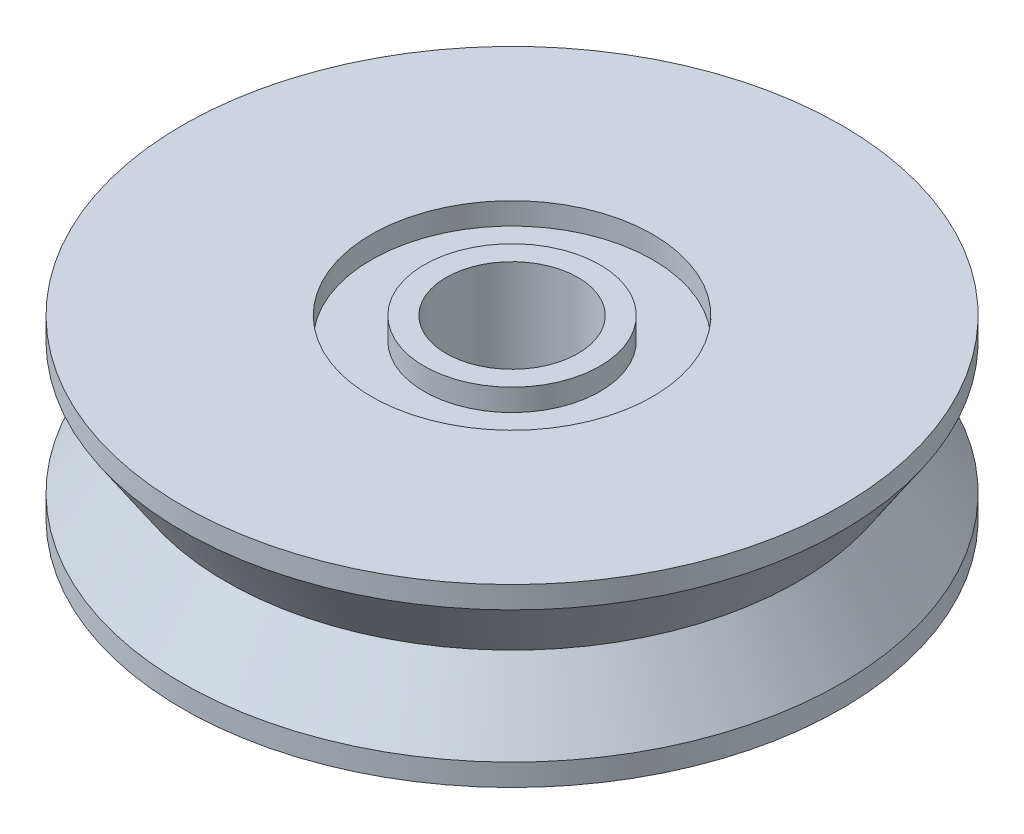
ISO-10303-21;
HEADER;
FILE_DESCRIPTION(('STEP AP214'),'2;1');
FILE_NAME('part.step','',(''),(''),'','','');
FILE_SCHEMA(('AUTOMOTIVE_DESIGN { 1 0 10303 214 1 1 1 1 }'));
ENDSEC;
DATA;
#1=APPLICATION_CONTEXT('core data for automotive mechanical design processes');
#2=APPLICATION_PROTOCOL_DEFINITION('international standard','automotive_design',2000,#1);
#3=PRODUCT_CONTEXT('',#1,'mechanical');
#4=PRODUCT('Part','Part','',(#3));
#5=PRODUCT_RELATED_PRODUCT_CATEGORY('part','',(#4));
#6=PRODUCT_DEFINITION_FORMATION('','',#4);
#7=PRODUCT_DEFINITION_CONTEXT('part definition',#1,'design');
#8=PRODUCT_DEFINITION('design','',#6,#7);
#9=PRODUCT_DEFINITION_SHAPE('','',#8);
#10=(LENGTH_UNIT() NAMED_UNIT(*) SI_UNIT(.MILLI.,.METRE.));
#11=(NAMED_UNIT(*) PLANE_ANGLE_UNIT() SI_UNIT($,.RADIAN.));
#12=(NAMED_UNIT(*) SI_UNIT($,.STERADIAN.) SOLID_ANGLE_UNIT());
#13=UNCERTAINTY_MEASURE_WITH_UNIT(LENGTH_MEASURE(1.E-05),#10,'distance_accuracy_value','');
#14=(GEOMETRIC_REPRESENTATION_CONTEXT(3) GLOBAL_UNCERTAINTY_ASSIGNED_CONTEXT((#13)) GLOBAL_UNIT_ASSIGNED_CONTEXT((#10,
#11,#12)) REPRESENTATION_CONTEXT('',''));
#15=CARTESIAN_POINT('',(0.,0.,0.));
#16=DIRECTION('',(0.,0.,1.));
#17=DIRECTION('',(1.,0.,0.));
#18=AXIS2_PLACEMENT_3D('',#15,#16,#17);
#19=CARTESIAN_POINT('',(0.,0.,0.));
#20=DIRECTION('',(0.,-1.,0.));
#21=DIRECTION('',(0.,0.,-1.));
#22=AXIS2_PLACEMENT_3D('',#19,#20,#21);
#23=CYLINDRICAL_SURFACE('',#22,1.5);
#24=CARTESIAN_POINT('',(0.,2.,0.));
#25=DIRECTION('',(0.,-1.,0.));
#26=DIRECTION('',(0.,0.,-1.));
#27=AXIS2_PLACEMENT_3D('',#24,#25,#26);
#28=CIRCLE('',#27,1.5);
#29=CARTESIAN_POINT('',(0.,2.,-1.5));
#30=VERTEX_POINT('',#29);
#31=EDGE_CURVE('E10',#30,#30,#28,.T.);
#32=ORIENTED_EDGE('',*,*,#31,.F.);
#33=EDGE_LOOP('',(#32));
#34=FACE_BOUND('',#33,.T.);
#35=CARTESIAN_POINT('',(0.,-2.,0.));
#36=DIRECTION('',(0.,-1.,0.));
#37=DIRECTION('',(0.,0.,-1.));
#38=AXIS2_PLACEMENT_3D('',#35,#36,#37);
#39=CIRCLE('',#38,1.5);
#40=CARTESIAN_POINT('',(0.,-2.,-1.5));
#41=VERTEX_POINT('',#40);
#42=EDGE_CURVE('E78',#41,#41,#39,.T.);
#43=ORIENTED_EDGE('',*,*,#42,.T.);
#44=EDGE_LOOP('',(#43));
#45=FACE_BOUND('',#44,.T.);
#46=ADVANCED_FACE('F39',(#34,#45),#23,.F.);
#47=CARTESIAN_POINT('',(-1.5,2.,0.));
#48=DIRECTION('',(0.,-1.,0.));
#49=DIRECTION('',(0.,0.,-1.));
#50=AXIS2_PLACEMENT_3D('',#47,#48,#49);
#51=PLANE('',#50);
#52=CARTESIAN_POINT('',(0.,2.,0.));
#53=DIRECTION('',(0.,-1.,0.));
#54=DIRECTION('',(0.,0.,-1.));
#55=AXIS2_PLACEMENT_3D('',#52,#53,#54);
#56=CIRCLE('',#55,2.);
#57=CARTESIAN_POINT('',(0.,2.,-2.));
#58=VERTEX_POINT('',#57);
#59=EDGE_CURVE('E46',#58,#58,#56,.T.);
#60=ORIENTED_EDGE('',*,*,#59,.F.);
#61=EDGE_LOOP('',(#60));
#62=FACE_BOUND('',#61,.T.);
#63=ORIENTED_EDGE('',*,*,#31,.T.);
#64=EDGE_LOOP('',(#63));
#65=FACE_BOUND('',#64,.T.);
#66=ADVANCED_FACE('F120',(#62,#65),#51,.F.);
#67=CARTESIAN_POINT('',(0.,0.,0.));
#68=DIRECTION('',(0.,-1.,0.));
#69=DIRECTION('',(0.,0.,-1.));
#70=AXIS2_PLACEMENT_3D('',#67,#68,#69);
#71=CYLINDRICAL_SURFACE('',#70,2.);
#72=CARTESIAN_POINT('',(0.,1.5,0.));
#73=DIRECTION('',(0.,-1.,0.));
#74=DIRECTION('',(0.,0.,-1.));
#75=AXIS2_PLACEMENT_3D('',#72,#73,#74);
#76=CIRCLE('',#75,2.);
#77=CARTESIAN_POINT('',(0.,1.5,-2.));
#78=VERTEX_POINT('',#77);
#79=EDGE_CURVE('E51',#78,#78,#76,.T.);
#80=ORIENTED_EDGE('',*,*,#79,.F.);
#81=EDGE_LOOP('',(#80));
#82=FACE_BOUND('',#81,.T.);
#83=ORIENTED_EDGE('',*,*,#59,.T.);
#84=EDGE_LOOP('',(#83));
#85=FACE_BOUND('',#84,.T.);
#86=ADVANCED_FACE('F125',(#82,#85),#71,.T.);
#87=CARTESIAN_POINT('',(-2.,1.5,0.));
#88=DIRECTION('',(0.,-1.,0.));
#89=DIRECTION('',(0.,0.,-1.));
#90=AXIS2_PLACEMENT_3D('',#87,#88,#89);
#91=PLANE('',#90);
#92=CARTESIAN_POINT('',(0.,1.5,0.));
#93=DIRECTION('',(0.,-1.,0.));
#94=DIRECTION('',(0.,0.,-1.));
#95=AXIS2_PLACEMENT_3D('',#92,#93,#94);
#96=CIRCLE('',#95,3.2);
#97=CARTESIAN_POINT('',(0.,1.5,-3.2));
#98=VERTEX_POINT('',#97);
#99=EDGE_CURVE('E56',#98,#98,#96,.T.);
#100=ORIENTED_EDGE('',*,*,#99,.F.);
#101=EDGE_LOOP('',(#100));
#102=FACE_BOUND('',#101,.T.);
#103=ORIENTED_EDGE('',*,*,#79,.T.);
#104=EDGE_LOOP('',(#103));
#105=FACE_BOUND('',#104,.T.);
#106=ADVANCED_FACE('F158',(#102,#105),#91,.F.);
#107=CARTESIAN_POINT('',(0.,0.,0.));
#108=DIRECTION('',(0.,-1.,0.));
#109=DIRECTION('',(0.,0.,-1.));
#110=AXIS2_PLACEMENT_3D('',#107,#108,#109);
#111=CYLINDRICAL_SURFACE('',#110,3.2);
#112=CARTESIAN_POINT('',(0.,2.,0.));
#113=DIRECTION('',(0.,-1.,0.));
#114=DIRECTION('',(0.,0.,-1.));
#115=AXIS2_PLACEMENT_3D('',#112,#113,#114);
#116=CIRCLE('',#115,3.2);
#117=CARTESIAN_POINT('',(0.,2.,-3.2));
#118=VERTEX_POINT('',#117);
#119=EDGE_CURVE('E62',#118,#118,#116,.T.);
#120=ORIENTED_EDGE('',*,*,#119,.F.);
#121=EDGE_LOOP('',(#120));
#122=FACE_BOUND('',#121,.T.);
#123=ORIENTED_EDGE('',*,*,#99,.T.);
#124=EDGE_LOOP('',(#123));
#125=FACE_BOUND('',#124,.T.);
#126=ADVANCED_FACE('F154',(#122,#125),#111,.F.);
#127=CARTESIAN_POINT('',(-3.2,2.,0.));
#128=DIRECTION('',(0.,-1.,0.));
#129=DIRECTION('',(0.,0.,-1.));
#130=AXIS2_PLACEMENT_3D('',#127,#128,#129);
#131=PLANE('',#130);
#132=CARTESIAN_POINT('',(0.,2.,0.));
#133=DIRECTION('',(0.,-1.,0.));
#134=DIRECTION('',(0.,0.,-1.));
#135=AXIS2_PLACEMENT_3D('',#132,#133,#134);
#136=CIRCLE('',#135,7.5);
#137=CARTESIAN_POINT('',(0.,2.,-7.5));
#138=VERTEX_POINT('',#137);
#139=EDGE_CURVE('E66',#138,#138,#136,.T.);
#140=ORIENTED_EDGE('',*,*,#139,.F.);
#141=EDGE_LOOP('',(#140));
#142=FACE_BOUND('',#141,.T.);
#143=ORIENTED_EDGE('',*,*,#119,.T.);
#144=EDGE_LOOP('',(#143));
#145=FACE_BOUND('',#144,.T.);
#146=ADVANCED_FACE('F150',(#142,#145),#131,.F.);
#147=CARTESIAN_POINT('',(0.,0.,0.));
#148=DIRECTION('',(0.,-1.,0.));
#149=DIRECTION('',(0.,0.,-1.));
#150=AXIS2_PLACEMENT_3D('',#147,#148,#149);
#151=CYLINDRICAL_SURFACE('',#150,7.5);
#152=CARTESIAN_POINT('',(0.,1.5,0.));
#153=DIRECTION('',(0.,-1.,0.));
#154=DIRECTION('',(0.,0.,-1.));
#155=AXIS2_PLACEMENT_3D('',#152,#153,#154);
#156=CIRCLE('',#155,7.5);
#157=CARTESIAN_POINT('',(0.,1.5,-7.5));
#158=VERTEX_POINT('',#157);
#159=EDGE_CURVE('E70',#158,#158,#156,.T.);
#160=ORIENTED_EDGE('',*,*,#159,.F.);
#161=EDGE_LOOP('',(#160));
#162=FACE_BOUND('',#161,.T.);
#163=ORIENTED_EDGE('',*,*,#139,.T.);
#164=EDGE_LOOP('',(#163));
#165=FACE_BOUND('',#164,.T.);
#166=ADVANCED_FACE('F143',(#162,#165),#151,.T.);
#167=CARTESIAN_POINT('',(0.,1.5,0.));
#168=DIRECTION('',(0.,1.,0.));
#169=DIRECTION('',(0.,0.,1.));
#170=AXIS2_PLACEMENT_3D('',#167,#168,#169);
#171=CONICAL_SURFACE('',#170,7.5,0.588002603547567);
#172=CARTESIAN_POINT('',(0.,0.,0.));
#173=DIRECTION('',(0.,-1.,0.));
#174=DIRECTION('',(0.,0.,-1.));
#175=AXIS2_PLACEMENT_3D('',#172,#173,#174);
#176=CIRCLE('',#175,6.5);
#177=CARTESIAN_POINT('',(0.,0.,-6.5));
#178=VERTEX_POINT('',#177);
#179=EDGE_CURVE('E74',#178,#178,#176,.T.);
#180=ORIENTED_EDGE('',*,*,#179,.F.);
#181=EDGE_LOOP('',(#180));
#182=FACE_BOUND('',#181,.T.);
#183=ORIENTED_EDGE('',*,*,#159,.T.);
#184=EDGE_LOOP('',(#183));
#185=FACE_BOUND('',#184,.T.);
#186=ADVANCED_FACE('F133',(#182,#185),#171,.T.);
#187=CARTESIAN_POINT('',(-1.5,-2.,0.));
#188=DIRECTION('',(0.,1.,0.));
#189=DIRECTION('',(0.,0.,-1.));
#190=AXIS2_PLACEMENT_3D('',#187,#188,#189);
#191=PLANE('',#190);
#192=CARTESIAN_POINT('',(0.,-2.,0.));
#193=DIRECTION('',(0.,-1.,0.));
#194=DIRECTION('',(0.,0.,-1.));
#195=AXIS2_PLACEMENT_3D('',#192,#193,#194);
#196=CIRCLE('',#195,2.);
#197=CARTESIAN_POINT('',(0.,-2.,-2.));
#198=VERTEX_POINT('',#197);
#199=EDGE_CURVE('E82',#198,#198,#196,.T.);
#200=ORIENTED_EDGE('',*,*,#199,.T.);
#201=EDGE_LOOP('',(#200));
#202=FACE_BOUND('',#201,.T.);
#203=ORIENTED_EDGE('',*,*,#42,.F.);
#204=EDGE_LOOP('',(#203));
#205=FACE_BOUND('',#204,.T.);
#206=ADVANCED_FACE('F130',(#202,#205),#191,.F.);
#207=CARTESIAN_POINT('',(0.,0.,0.));
#208=DIRECTION('',(0.,1.,0.));
#209=DIRECTION('',(0.,0.,-1.));
#210=AXIS2_PLACEMENT_3D('',#207,#208,#209);
#211=CYLINDRICAL_SURFACE('',#210,2.);
#212=CARTESIAN_POINT('',(0.,-1.5,0.));
#213=DIRECTION('',(0.,-1.,0.));
#214=DIRECTION('',(0.,0.,-1.));
#215=AXIS2_PLACEMENT_3D('',#212,#213,#214);
#216=CIRCLE('',#215,2.);
#217=CARTESIAN_POINT('',(0.,-1.5,-2.));
#218=VERTEX_POINT('',#217);
#219=EDGE_CURVE('E86',#218,#218,#216,.T.);
#220=ORIENTED_EDGE('',*,*,#219,.T.);
#221=EDGE_LOOP('',(#220));
#222=FACE_BOUND('',#221,.T.);
#223=ORIENTED_EDGE('',*,*,#199,.F.);
#224=EDGE_LOOP('',(#223));
#225=FACE_BOUND('',#224,.T.);
#226=ADVANCED_FACE('F132',(#222,#225),#211,.T.);
#227=CARTESIAN_POINT('',(-2.,-1.5,0.));
#228=DIRECTION('',(0.,1.,0.));
#229=DIRECTION('',(0.,0.,-1.));
#230=AXIS2_PLACEMENT_3D('',#227,#228,#229);
#231=PLANE('',#230);
#232=CARTESIAN_POINT('',(0.,-1.5,0.));
#233=DIRECTION('',(0.,-1.,0.));
#234=DIRECTION('',(0.,0.,-1.));
#235=AXIS2_PLACEMENT_3D('',#232,#233,#234);
#236=CIRCLE('',#235,3.2);
#237=CARTESIAN_POINT('',(0.,-1.5,-3.2));
#238=VERTEX_POINT('',#237);
#239=EDGE_CURVE('E90',#238,#238,#236,.T.);
#240=ORIENTED_EDGE('',*,*,#239,.T.);
#241=EDGE_LOOP('',(#240));
#242=FACE_BOUND('',#241,.T.);
#243=ORIENTED_EDGE('',*,*,#219,.F.);
#244=EDGE_LOOP('',(#243));
#245=FACE_BOUND('',#244,.T.);
#246=ADVANCED_FACE('F140',(#242,#245),#231,.F.);
#247=CARTESIAN_POINT('',(0.,0.,0.));
#248=DIRECTION('',(0.,1.,0.));
#249=DIRECTION('',(0.,0.,-1.));
#250=AXIS2_PLACEMENT_3D('',#247,#248,#249);
#251=CYLINDRICAL_SURFACE('',#250,3.2);
#252=CARTESIAN_POINT('',(0.,-2.,0.));
#253=DIRECTION('',(0.,-1.,0.));
#254=DIRECTION('',(0.,0.,-1.));
#255=AXIS2_PLACEMENT_3D('',#252,#253,#254);
#256=CIRCLE('',#255,3.2);
#257=CARTESIAN_POINT('',(0.,-2.,-3.2));
#258=VERTEX_POINT('',#257);
#259=EDGE_CURVE('E94',#258,#258,#256,.T.);
#260=ORIENTED_EDGE('',*,*,#259,.T.);
#261=EDGE_LOOP('',(#260));
#262=FACE_BOUND('',#261,.T.);
#263=ORIENTED_EDGE('',*,*,#239,.F.);
#264=EDGE_LOOP('',(#263));
#265=FACE_BOUND('',#264,.T.);
#266=ADVANCED_FACE('F215',(#262,#265),#251,.F.);
#267=CARTESIAN_POINT('',(-3.2,-2.,0.));
#268=DIRECTION('',(0.,1.,0.));
#269=DIRECTION('',(0.,0.,-1.));
#270=AXIS2_PLACEMENT_3D('',#267,#268,#269);
#271=PLANE('',#270);
#272=CARTESIAN_POINT('',(0.,-2.,0.));
#273=DIRECTION('',(0.,-1.,0.));
#274=DIRECTION('',(0.,0.,-1.));
#275=AXIS2_PLACEMENT_3D('',#272,#273,#274);
#276=CIRCLE('',#275,7.5);
#277=CARTESIAN_POINT('',(0.,-2.,-7.5));
#278=VERTEX_POINT('',#277);
#279=EDGE_CURVE('E98',#278,#278,#276,.T.);
#280=ORIENTED_EDGE('',*,*,#279,.T.);
#281=EDGE_LOOP('',(#280));
#282=FACE_BOUND('',#281,.T.);
#283=ORIENTED_EDGE('',*,*,#259,.F.);
#284=EDGE_LOOP('',(#283));
#285=FACE_BOUND('',#284,.T.);
#286=ADVANCED_FACE('F117',(#282,#285),#271,.F.);
#287=CARTESIAN_POINT('',(0.,0.,0.));
#288=DIRECTION('',(0.,1.,0.));
#289=DIRECTION('',(0.,0.,-1.));
#290=AXIS2_PLACEMENT_3D('',#287,#288,#289);
#291=CYLINDRICAL_SURFACE('',#290,7.5);
#292=CARTESIAN_POINT('',(0.,-1.5,0.));
#293=DIRECTION('',(0.,-1.,0.));
#294=DIRECTION('',(0.,0.,-1.));
#295=AXIS2_PLACEMENT_3D('',#292,#293,#294);
#296=CIRCLE('',#295,7.5);
#297=CARTESIAN_POINT('',(0.,-1.5,-7.5));
#298=VERTEX_POINT('',#297);
#299=EDGE_CURVE('E102',#298,#298,#296,.T.);
#300=ORIENTED_EDGE('',*,*,#299,.T.);
#301=EDGE_LOOP('',(#300));
#302=FACE_BOUND('',#301,.T.);
#303=ORIENTED_EDGE('',*,*,#279,.F.);
#304=EDGE_LOOP('',(#303));
#305=FACE_BOUND('',#304,.T.);
#306=ADVANCED_FACE('F107',(#302,#305),#291,.T.);
#307=CARTESIAN_POINT('',(0.,-1.5,0.));
#308=DIRECTION('',(0.,-1.,0.));
#309=DIRECTION('',(0.,0.,1.));
#310=AXIS2_PLACEMENT_3D('',#307,#308,#309);
#311=CONICAL_SURFACE('',#310,7.5,0.588002603547567);
#312=ORIENTED_EDGE('',*,*,#179,.T.);
#313=EDGE_LOOP('',(#312));
#314=FACE_BOUND('',#313,.T.);
#315=ORIENTED_EDGE('',*,*,#299,.F.);
#316=EDGE_LOOP('',(#315));
#317=FACE_BOUND('',#316,.T.);
#318=ADVANCED_FACE('F110',(#314,#317),#311,.T.);
#319=CLOSED_SHELL('',(#46,#66,#86,#106,#126,#146,#166,#186,#206,#226,#246,#266,#286,#306,#318));
#320=MANIFOLD_SOLID_BREP('B2',#319);
#321=ADVANCED_BREP_SHAPE_REPRESENTATION('',(#18,#320),#14);
#322=SHAPE_DEFINITION_REPRESENTATION(#9,#321);
ENDSEC;
END-ISO-10303-21;
